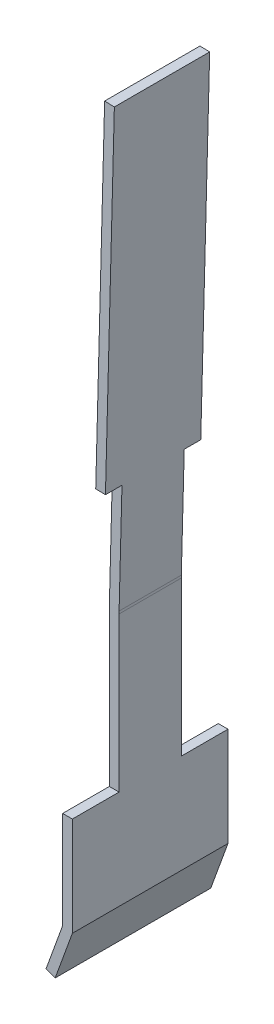
ISO-10303-21;
HEADER;
FILE_DESCRIPTION(('STEP AP214'),'2;1');
FILE_NAME('part.step','',(''),(''),'','','');
FILE_SCHEMA(('AUTOMOTIVE_DESIGN { 1 0 10303 214 1 1 1 1 }'));
ENDSEC;
DATA;
#1=APPLICATION_CONTEXT('core data for automotive mechanical design processes');
#2=APPLICATION_PROTOCOL_DEFINITION('international standard','automotive_design',2000,#1);
#3=PRODUCT_CONTEXT('',#1,'mechanical');
#4=PRODUCT('Part','Part','',(#3));
#5=PRODUCT_RELATED_PRODUCT_CATEGORY('part','',(#4));
#6=PRODUCT_DEFINITION_FORMATION('','',#4);
#7=PRODUCT_DEFINITION_CONTEXT('part definition',#1,'design');
#8=PRODUCT_DEFINITION('design','',#6,#7);
#9=PRODUCT_DEFINITION_SHAPE('','',#8);
#10=(LENGTH_UNIT() NAMED_UNIT(*) SI_UNIT(.MILLI.,.METRE.));
#11=(NAMED_UNIT(*) PLANE_ANGLE_UNIT() SI_UNIT($,.RADIAN.));
#12=(NAMED_UNIT(*) SI_UNIT($,.STERADIAN.) SOLID_ANGLE_UNIT());
#13=UNCERTAINTY_MEASURE_WITH_UNIT(LENGTH_MEASURE(1.E-05),#10,'distance_accuracy_value','');
#14=(GEOMETRIC_REPRESENTATION_CONTEXT(3) GLOBAL_UNCERTAINTY_ASSIGNED_CONTEXT((#13)) GLOBAL_UNIT_ASSIGNED_CONTEXT((#10,
#11,#12)) REPRESENTATION_CONTEXT('',''));
#15=CARTESIAN_POINT('',(0.,0.,0.));
#16=DIRECTION('',(0.,0.,1.));
#17=DIRECTION('',(1.,0.,0.));
#18=AXIS2_PLACEMENT_3D('',#15,#16,#17);
#19=CARTESIAN_POINT('',(11.,17.8560021120668,16.));
#20=DIRECTION('',(0.,0.,1.));
#21=DIRECTION('',(1.,0.,0.));
#22=AXIS2_PLACEMENT_3D('',#19,#20,#21);
#23=CYLINDRICAL_SURFACE('',#22,10.);
#24=DIRECTION('',(0.,0.,-1.));
#25=VECTOR('',#24,1.);
#26=CARTESIAN_POINT('',(1.00342675024443,18.1177715951455,16.));
#27=LINE('',#26,#25);
#28=CARTESIAN_POINT('',(1.00342675024443,18.1177715951456,11.2));
#29=VERTEX_POINT('',#28);
#30=CARTESIAN_POINT('',(1.00342675024443,18.1177715951456,4.8));
#31=VERTEX_POINT('',#30);
#32=EDGE_CURVE('E353',#29,#31,#27,.T.);
#33=ORIENTED_EDGE('',*,*,#32,.F.);
#34=CARTESIAN_POINT('',(11.,17.8560021120668,11.2));
#35=DIRECTION('',(0.,0.,-1.));
#36=DIRECTION('',(-1.,0.,0.));
#37=AXIS2_PLACEMENT_3D('',#34,#35,#36);
#38=CIRCLE('',#37,10.);
#39=CARTESIAN_POINT('',(1.,17.8560021120668,11.2));
#40=VERTEX_POINT('',#39);
#41=EDGE_CURVE('E49',#29,#40,#38,.F.);
#42=ORIENTED_EDGE('',*,*,#41,.T.);
#43=DIRECTION('',(0.,0.,-1.));
#44=VECTOR('',#43,1.);
#45=CARTESIAN_POINT('',(1.,17.8560021120668,16.));
#46=LINE('',#45,#44);
#47=CARTESIAN_POINT('',(1.,17.8560021120668,4.8));
#48=VERTEX_POINT('',#47);
#49=EDGE_CURVE('E357',#48,#40,#46,.F.);
#50=ORIENTED_EDGE('',*,*,#49,.F.);
#51=CARTESIAN_POINT('',(11.,17.8560021120668,4.8));
#52=DIRECTION('',(0.,0.,1.));
#53=DIRECTION('',(0.,-1.,0.));
#54=AXIS2_PLACEMENT_3D('',#51,#52,#53);
#55=CIRCLE('',#54,10.);
#56=EDGE_CURVE('E11',#48,#31,#55,.F.);
#57=ORIENTED_EDGE('',*,*,#56,.T.);
#58=EDGE_LOOP('',(#33,#42,#50,#57));
#59=FACE_BOUND('',#58,.T.);
#60=ADVANCED_FACE('F41',(#59),#23,.F.);
#61=CARTESIAN_POINT('',(10.,17.8690928291517,16.));
#62=DIRECTION('',(0.,0.,1.));
#63=DIRECTION('',(1.,0.,0.));
#64=AXIS2_PLACEMENT_3D('',#61,#62,#63);
#65=CYLINDRICAL_SURFACE('',#64,10.);
#66=DIRECTION('',(0.,0.,1.));
#67=VECTOR('',#66,1.);
#68=CARTESIAN_POINT('',(0.00342675024442819,18.1308623122304,16.));
#69=LINE('',#68,#67);
#70=CARTESIAN_POINT('',(0.00342675024442779,18.1308623122304,4.8));
#71=VERTEX_POINT('',#70);
#72=CARTESIAN_POINT('',(0.00342675024442784,18.1308623122304,11.2));
#73=VERTEX_POINT('',#72);
#74=EDGE_CURVE('E339',#71,#73,#69,.T.);
#75=ORIENTED_EDGE('',*,*,#74,.F.);
#76=CARTESIAN_POINT('',(10.,17.8690928291517,4.8));
#77=DIRECTION('',(0.,0.,1.));
#78=DIRECTION('',(0.,-1.,0.));
#79=AXIS2_PLACEMENT_3D('',#76,#77,#78);
#80=CIRCLE('',#79,10.);
#81=CARTESIAN_POINT('',(0.,17.8690928291516,4.8));
#82=VERTEX_POINT('',#81);
#83=EDGE_CURVE('E350',#82,#71,#80,.F.);
#84=ORIENTED_EDGE('',*,*,#83,.F.);
#85=DIRECTION('',(0.,0.,1.));
#86=VECTOR('',#85,1.);
#87=CARTESIAN_POINT('',(0.,17.8690928291517,16.));
#88=LINE('',#87,#86);
#89=CARTESIAN_POINT('',(0.,17.8690928291516,11.2));
#90=VERTEX_POINT('',#89);
#91=EDGE_CURVE('E346',#90,#82,#88,.F.);
#92=ORIENTED_EDGE('',*,*,#91,.F.);
#93=CARTESIAN_POINT('',(10.,17.8690928291517,11.2));
#94=DIRECTION('',(0.,0.,-1.));
#95=DIRECTION('',(0.,1.,0.));
#96=AXIS2_PLACEMENT_3D('',#93,#94,#95);
#97=CIRCLE('',#96,10.);
#98=EDGE_CURVE('E343',#73,#90,#97,.F.);
#99=ORIENTED_EDGE('',*,*,#98,.F.);
#100=EDGE_LOOP('',(#75,#84,#92,#99));
#101=FACE_BOUND('',#100,.T.);
#102=ADVANCED_FACE('F408',(#101),#65,.T.);
#103=CARTESIAN_POINT('',(0.,0.,16.));
#104=DIRECTION('',(0.,0.,-1.));
#105=DIRECTION('',(-1.,0.,0.));
#106=AXIS2_PLACEMENT_3D('',#103,#104,#105);
#107=PLANE('',#106);
#108=DIRECTION('',(0.,1.,0.));
#109=VECTOR('',#108,1.);
#110=CARTESIAN_POINT('',(1.,0.,16.));
#111=LINE('',#110,#109);
#112=CARTESIAN_POINT('',(0.999999999999999,-8.17632698070847,16.));
#113=VERTEX_POINT('',#112);
#114=CARTESIAN_POINT('',(1.,1.99850372470002,16.));
#115=VERTEX_POINT('',#114);
#116=EDGE_CURVE('E318',#113,#115,#111,.T.);
#117=ORIENTED_EDGE('',*,*,#116,.T.);
#118=DIRECTION('',(1.,0.,0.));
#119=VECTOR('',#118,1.);
#120=CARTESIAN_POINT('',(-9.,1.99850372470002,16.));
#121=LINE('',#120,#119);
#122=CARTESIAN_POINT('',(0.,1.99850372470002,16.));
#123=VERTEX_POINT('',#122);
#124=EDGE_CURVE('E230',#123,#115,#121,.T.);
#125=ORIENTED_EDGE('',*,*,#124,.F.);
#126=DIRECTION('',(0.,1.,0.));
#127=VECTOR('',#126,1.);
#128=CARTESIAN_POINT('',(0.,0.,16.));
#129=LINE('',#128,#127);
#130=CARTESIAN_POINT('',(0.,-8.,16.));
#131=VERTEX_POINT('',#130);
#132=EDGE_CURVE('E314',#131,#123,#129,.T.);
#133=ORIENTED_EDGE('',*,*,#132,.F.);
#134=DIRECTION('',(-0.342020143325671,-0.939692620785908,0.));
#135=VECTOR('',#134,1.);
#136=CARTESIAN_POINT('',(0.,-8.,16.));
#137=LINE('',#136,#135);
#138=CARTESIAN_POINT('',(-1.71010071662835,-12.6984631039295,16.));
#139=VERTEX_POINT('',#138);
#140=EDGE_CURVE('E171',#131,#139,#137,.T.);
#141=ORIENTED_EDGE('',*,*,#140,.T.);
#142=DIRECTION('',(0.939692620785908,-0.342020143325671,0.));
#143=VECTOR('',#142,1.);
#144=CARTESIAN_POINT('',(-1.71010071662835,-12.6984631039295,16.));
#145=LINE('',#144,#143);
#146=CARTESIAN_POINT('',(-0.770408095842446,-13.0404832472552,16.));
#147=VERTEX_POINT('',#146);
#148=EDGE_CURVE('E164',#139,#147,#145,.T.);
#149=ORIENTED_EDGE('',*,*,#148,.T.);
#150=DIRECTION('',(-0.342020143325671,-0.939692620785908,0.));
#151=VECTOR('',#150,1.);
#152=CARTESIAN_POINT('',(0.939692620785907,-8.34202014332567,16.));
#153=LINE('',#152,#151);
#154=EDGE_CURVE('E169',#113,#147,#153,.T.);
#155=ORIENTED_EDGE('',*,*,#154,.F.);
#156=EDGE_LOOP('',(#117,#125,#133,#141,#149,#155));
#157=FACE_BOUND('',#156,.T.);
#158=ADVANCED_FACE('F167',(#157),#107,.F.);
#159=CARTESIAN_POINT('',(0.999657324975557,17.9738230516921,16.));
#160=DIRECTION('',(-0.999657324975557,0.0261769483078733,0.));
#161=DIRECTION('',(-0.0261769483078733,-0.999657324975557,0.));
#162=AXIS2_PLACEMENT_3D('',#159,#160,#161);
#163=PLANE('',#162);
#164=DIRECTION('',(0.0261769483078733,0.999657324975557,0.));
#165=VECTOR('',#164,1.);
#166=CARTESIAN_POINT('',(2.21688542129167,64.4578886630555,11.2));
#167=LINE('',#166,#165);
#168=CARTESIAN_POINT('',(1.3006922305161,29.4698822889111,11.2));
#169=VERTEX_POINT('',#168);
#170=EDGE_CURVE('E308',#29,#169,#167,.T.);
#171=ORIENTED_EDGE('',*,*,#170,.F.);
#172=ORIENTED_EDGE('',*,*,#32,.T.);
#173=DIRECTION('',(-0.0261769483078733,-0.999657324975557,0.));
#174=VECTOR('',#173,1.);
#175=CARTESIAN_POINT('',(2.21688542129167,64.4578886630555,4.8));
#176=LINE('',#175,#174);
#177=CARTESIAN_POINT('',(1.3006922305161,29.4698822889111,4.8));
#178=VERTEX_POINT('',#177);
#179=EDGE_CURVE('E307',#178,#31,#176,.T.);
#180=ORIENTED_EDGE('',*,*,#179,.F.);
#181=DIRECTION('',(0.,0.,1.));
#182=VECTOR('',#181,1.);
#183=CARTESIAN_POINT('',(1.3006922305161,29.4698822889111,3.1));
#184=LINE('',#183,#182);
#185=CARTESIAN_POINT('',(1.3006922305161,29.4698822889111,3.1));
#186=VERTEX_POINT('',#185);
#187=EDGE_CURVE('E247',#186,#178,#184,.T.);
#188=ORIENTED_EDGE('',*,*,#187,.F.);
#189=DIRECTION('',(-0.0261769483078733,-0.999657324975557,0.));
#190=VECTOR('',#189,1.);
#191=CARTESIAN_POINT('',(2.21688542129167,64.4578886630555,3.1));
#192=LINE('',#191,#190);
#193=CARTESIAN_POINT('',(2.21688542129167,64.4578886630555,3.1));
#194=VERTEX_POINT('',#193);
#195=EDGE_CURVE('E243',#194,#186,#192,.T.);
#196=ORIENTED_EDGE('',*,*,#195,.F.);
#197=DIRECTION('',(0.,0.,-1.));
#198=VECTOR('',#197,1.);
#199=CARTESIAN_POINT('',(2.21688542129167,64.4578886630556,16.));
#200=LINE('',#199,#198);
#201=CARTESIAN_POINT('',(2.21688542129167,64.4578886630555,12.9));
#202=VERTEX_POINT('',#201);
#203=EDGE_CURVE('E331',#202,#194,#200,.T.);
#204=ORIENTED_EDGE('',*,*,#203,.F.);
#205=DIRECTION('',(0.0261769483078733,0.999657324975557,0.));
#206=VECTOR('',#205,1.);
#207=CARTESIAN_POINT('',(2.21688542129167,64.4578886630555,12.9));
#208=LINE('',#207,#206);
#209=CARTESIAN_POINT('',(1.3006922305161,29.4698822889111,12.9));
#210=VERTEX_POINT('',#209);
#211=EDGE_CURVE('E272',#210,#202,#208,.T.);
#212=ORIENTED_EDGE('',*,*,#211,.F.);
#213=DIRECTION('',(0.,0.,1.));
#214=VECTOR('',#213,1.);
#215=CARTESIAN_POINT('',(1.3006922305161,29.4698822889111,12.9));
#216=LINE('',#215,#214);
#217=EDGE_CURVE('E268',#169,#210,#216,.T.);
#218=ORIENTED_EDGE('',*,*,#217,.F.);
#219=EDGE_LOOP('',(#171,#172,#180,#188,#196,#204,#212,#218));
#220=FACE_BOUND('',#219,.T.);
#221=ADVANCED_FACE('F393',(#220),#163,.F.);
#222=CARTESIAN_POINT('',(1.21722809631611,64.4840656113634,16.));
#223=DIRECTION('',(0.0261769483078517,0.999657324975558,0.));
#224=DIRECTION('',(-0.999657324975558,0.0261769483078517,0.));
#225=AXIS2_PLACEMENT_3D('',#222,#223,#224);
#226=PLANE('',#225);
#227=DIRECTION('',(0.,0.,-1.));
#228=VECTOR('',#227,1.);
#229=CARTESIAN_POINT('',(1.21722809631611,64.4840656113634,16.));
#230=LINE('',#229,#228);
#231=CARTESIAN_POINT('',(1.21722809631611,64.4840656113634,12.9));
#232=VERTEX_POINT('',#231);
#233=CARTESIAN_POINT('',(1.21722809631611,64.4840656113634,3.1));
#234=VERTEX_POINT('',#233);
#235=EDGE_CURVE('E322',#232,#234,#230,.T.);
#236=ORIENTED_EDGE('',*,*,#235,.F.);
#237=DIRECTION('',(-0.999657324975557,0.0261769483078733,0.));
#238=VECTOR('',#237,1.);
#239=CARTESIAN_POINT('',(2.21688542129167,64.4578886630555,12.9));
#240=LINE('',#239,#238);
#241=EDGE_CURVE('E284',#202,#232,#240,.T.);
#242=ORIENTED_EDGE('',*,*,#241,.F.);
#243=ORIENTED_EDGE('',*,*,#203,.T.);
#244=DIRECTION('',(-0.999657324975557,0.0261769483078733,0.));
#245=VECTOR('',#244,1.);
#246=CARTESIAN_POINT('',(2.21688542129167,64.4578886630555,3.1));
#247=LINE('',#246,#245);
#248=EDGE_CURVE('E252',#194,#234,#247,.T.);
#249=ORIENTED_EDGE('',*,*,#248,.T.);
#250=EDGE_LOOP('',(#236,#242,#243,#249));
#251=FACE_BOUND('',#250,.T.);
#252=ADVANCED_FACE('F419',(#251),#226,.T.);
#253=CARTESIAN_POINT('',(0.,18.,16.));
#254=DIRECTION('',(-0.999657324975557,0.0261769483078733,0.));
#255=DIRECTION('',(-0.0261769483078733,-0.999657324975557,0.));
#256=AXIS2_PLACEMENT_3D('',#253,#254,#255);
#257=PLANE('',#256);
#258=DIRECTION('',(0.0261769483078733,0.999657324975557,0.));
#259=VECTOR('',#258,1.);
#260=CARTESIAN_POINT('',(0.,18.,4.8));
#261=LINE('',#260,#259);
#262=CARTESIAN_POINT('',(0.301034905540543,29.4960592372189,4.8));
#263=VERTEX_POINT('',#262);
#264=EDGE_CURVE('E61',#71,#263,#261,.T.);
#265=ORIENTED_EDGE('',*,*,#264,.F.);
#266=ORIENTED_EDGE('',*,*,#74,.T.);
#267=DIRECTION('',(-0.0261769483078733,-0.999657324975557,0.));
#268=VECTOR('',#267,1.);
#269=CARTESIAN_POINT('',(0.,18.,11.2));
#270=LINE('',#269,#268);
#271=CARTESIAN_POINT('',(0.301034905540543,29.4960592372189,11.2));
#272=VERTEX_POINT('',#271);
#273=EDGE_CURVE('E336',#272,#73,#270,.T.);
#274=ORIENTED_EDGE('',*,*,#273,.F.);
#275=DIRECTION('',(0.,0.,1.));
#276=VECTOR('',#275,1.);
#277=CARTESIAN_POINT('',(0.301034905540543,29.4960592372189,12.9));
#278=LINE('',#277,#276);
#279=CARTESIAN_POINT('',(0.301034905540543,29.4960592372189,12.9));
#280=VERTEX_POINT('',#279);
#281=EDGE_CURVE('E261',#272,#280,#278,.T.);
#282=ORIENTED_EDGE('',*,*,#281,.T.);
#283=DIRECTION('',(0.0261769483078733,0.999657324975557,0.));
#284=VECTOR('',#283,1.);
#285=CARTESIAN_POINT('',(1.21722809631611,64.4840656113634,12.9));
#286=LINE('',#285,#284);
#287=EDGE_CURVE('E273',#280,#232,#286,.T.);
#288=ORIENTED_EDGE('',*,*,#287,.T.);
#289=ORIENTED_EDGE('',*,*,#235,.T.);
#290=DIRECTION('',(-0.0261769483078733,-0.999657324975557,0.));
#291=VECTOR('',#290,1.);
#292=CARTESIAN_POINT('',(1.21722809631611,64.4840656113634,3.1));
#293=LINE('',#292,#291);
#294=CARTESIAN_POINT('',(0.301034905540543,29.4960592372189,3.1));
#295=VERTEX_POINT('',#294);
#296=EDGE_CURVE('E242',#234,#295,#293,.T.);
#297=ORIENTED_EDGE('',*,*,#296,.T.);
#298=DIRECTION('',(0.,0.,1.));
#299=VECTOR('',#298,1.);
#300=CARTESIAN_POINT('',(0.301034905540543,29.4960592372189,3.1));
#301=LINE('',#300,#299);
#302=EDGE_CURVE('E248',#295,#263,#301,.T.);
#303=ORIENTED_EDGE('',*,*,#302,.T.);
#304=EDGE_LOOP('',(#265,#266,#274,#282,#288,#289,#297,#303));
#305=FACE_BOUND('',#304,.T.);
#306=ADVANCED_FACE('F403',(#305),#257,.T.);
#307=CARTESIAN_POINT('',(0.,0.,16.));
#308=DIRECTION('',(-1.,0.,0.));
#309=DIRECTION('',(0.,0.,1.));
#310=AXIS2_PLACEMENT_3D('',#307,#308,#309);
#311=PLANE('',#310);
#312=DIRECTION('',(0.,1.,0.));
#313=VECTOR('',#312,1.);
#314=CARTESIAN_POINT('',(0.,0.,4.8));
#315=LINE('',#314,#313);
#316=CARTESIAN_POINT('',(0.,1.99850372470002,4.8));
#317=VERTEX_POINT('',#316);
#318=EDGE_CURVE('E304',#317,#82,#315,.T.);
#319=ORIENTED_EDGE('',*,*,#318,.F.);
#320=DIRECTION('',(0.,0.,1.));
#321=VECTOR('',#320,1.);
#322=CARTESIAN_POINT('',(0.,1.99850372470002,16.));
#323=LINE('',#322,#321);
#324=CARTESIAN_POINT('',(0.,1.99850372470002,0.));
#325=VERTEX_POINT('',#324);
#326=EDGE_CURVE('E223',#325,#317,#323,.T.);
#327=ORIENTED_EDGE('',*,*,#326,.F.);
#328=DIRECTION('',(0.,1.,0.));
#329=VECTOR('',#328,1.);
#330=CARTESIAN_POINT('',(0.,0.,0.));
#331=LINE('',#330,#329);
#332=CARTESIAN_POINT('',(0.,-8.,0.));
#333=VERTEX_POINT('',#332);
#334=EDGE_CURVE('E311',#333,#325,#331,.T.);
#335=ORIENTED_EDGE('',*,*,#334,.F.);
#336=DIRECTION('',(0.,0.,-1.));
#337=VECTOR('',#336,1.);
#338=CARTESIAN_POINT('',(0.,-8.,16.));
#339=LINE('',#338,#337);
#340=EDGE_CURVE('E208',#131,#333,#339,.T.);
#341=ORIENTED_EDGE('',*,*,#340,.F.);
#342=ORIENTED_EDGE('',*,*,#132,.T.);
#343=DIRECTION('',(0.,0.,1.));
#344=VECTOR('',#343,1.);
#345=CARTESIAN_POINT('',(0.,1.99850372470002,16.));
#346=LINE('',#345,#344);
#347=CARTESIAN_POINT('',(0.,1.99850372470002,11.2));
#348=VERTEX_POINT('',#347);
#349=EDGE_CURVE('E239',#348,#123,#346,.T.);
#350=ORIENTED_EDGE('',*,*,#349,.F.);
#351=DIRECTION('',(0.,-1.,0.));
#352=VECTOR('',#351,1.);
#353=CARTESIAN_POINT('',(0.,0.,11.2));
#354=LINE('',#353,#352);
#355=EDGE_CURVE('E298',#90,#348,#354,.T.);
#356=ORIENTED_EDGE('',*,*,#355,.F.);
#357=ORIENTED_EDGE('',*,*,#91,.T.);
#358=EDGE_LOOP('',(#319,#327,#335,#341,#342,#350,#356,#357));
#359=FACE_BOUND('',#358,.T.);
#360=ADVANCED_FACE('F380',(#359),#311,.T.);
#361=CARTESIAN_POINT('',(1.,0.,16.));
#362=DIRECTION('',(-1.,0.,0.));
#363=DIRECTION('',(0.,0.,1.));
#364=AXIS2_PLACEMENT_3D('',#361,#362,#363);
#365=PLANE('',#364);
#366=DIRECTION('',(0.,0.,-1.));
#367=VECTOR('',#366,1.);
#368=CARTESIAN_POINT('',(1.,1.99850372470002,4.8));
#369=LINE('',#368,#367);
#370=CARTESIAN_POINT('',(1.,1.99850372470002,4.8));
#371=VERTEX_POINT('',#370);
#372=CARTESIAN_POINT('',(1.,1.99850372470002,0.));
#373=VERTEX_POINT('',#372);
#374=EDGE_CURVE('E214',#371,#373,#369,.T.);
#375=ORIENTED_EDGE('',*,*,#374,.F.);
#376=DIRECTION('',(0.,-1.,0.));
#377=VECTOR('',#376,1.);
#378=CARTESIAN_POINT('',(1.,17.9869092829152,4.8));
#379=LINE('',#378,#377);
#380=EDGE_CURVE('E295',#48,#371,#379,.T.);
#381=ORIENTED_EDGE('',*,*,#380,.F.);
#382=ORIENTED_EDGE('',*,*,#49,.T.);
#383=DIRECTION('',(0.,1.,0.));
#384=VECTOR('',#383,1.);
#385=CARTESIAN_POINT('',(1.,17.9869092829152,11.2));
#386=LINE('',#385,#384);
#387=CARTESIAN_POINT('',(1.,1.99850372470002,11.2));
#388=VERTEX_POINT('',#387);
#389=EDGE_CURVE('E288',#388,#40,#386,.T.);
#390=ORIENTED_EDGE('',*,*,#389,.F.);
#391=DIRECTION('',(0.,0.,-1.));
#392=VECTOR('',#391,1.);
#393=CARTESIAN_POINT('',(1.,1.99850372470002,11.2));
#394=LINE('',#393,#392);
#395=EDGE_CURVE('E207',#115,#388,#394,.T.);
#396=ORIENTED_EDGE('',*,*,#395,.F.);
#397=ORIENTED_EDGE('',*,*,#116,.F.);
#398=DIRECTION('',(0.,0.,-1.));
#399=VECTOR('',#398,1.);
#400=CARTESIAN_POINT('',(0.999999999999999,-8.17632698070847,16.));
#401=LINE('',#400,#399);
#402=CARTESIAN_POINT('',(0.999999999999999,-8.17632698070847,0.));
#403=VERTEX_POINT('',#402);
#404=EDGE_CURVE('E191',#113,#403,#401,.T.);
#405=ORIENTED_EDGE('',*,*,#404,.T.);
#406=DIRECTION('',(0.,1.,0.));
#407=VECTOR('',#406,1.);
#408=CARTESIAN_POINT('',(1.,0.,0.));
#409=LINE('',#408,#407);
#410=EDGE_CURVE('E319',#403,#373,#409,.T.);
#411=ORIENTED_EDGE('',*,*,#410,.T.);
#412=EDGE_LOOP('',(#375,#381,#382,#390,#396,#397,#405,#411));
#413=FACE_BOUND('',#412,.T.);
#414=ADVANCED_FACE('F369',(#413),#365,.F.);
#415=CARTESIAN_POINT('',(0.,0.,0.));
#416=DIRECTION('',(0.,0.,-1.));
#417=DIRECTION('',(-1.,0.,0.));
#418=AXIS2_PLACEMENT_3D('',#415,#416,#417);
#419=PLANE('',#418);
#420=DIRECTION('',(1.,0.,0.));
#421=VECTOR('',#420,1.);
#422=CARTESIAN_POINT('',(-9.,1.99850372470002,0.));
#423=LINE('',#422,#421);
#424=EDGE_CURVE('E219',#325,#373,#423,.T.);
#425=ORIENTED_EDGE('',*,*,#424,.T.);
#426=ORIENTED_EDGE('',*,*,#410,.F.);
#427=DIRECTION('',(-0.342020143325671,-0.939692620785908,0.));
#428=VECTOR('',#427,1.);
#429=CARTESIAN_POINT('',(0.939692620785907,-8.34202014332567,0.));
#430=LINE('',#429,#428);
#431=CARTESIAN_POINT('',(-0.770408095842446,-13.0404832472552,0.));
#432=VERTEX_POINT('',#431);
#433=EDGE_CURVE('E200',#403,#432,#430,.T.);
#434=ORIENTED_EDGE('',*,*,#433,.T.);
#435=DIRECTION('',(0.939692620785908,-0.342020143325671,0.));
#436=VECTOR('',#435,1.);
#437=CARTESIAN_POINT('',(-1.71010071662835,-12.6984631039295,0.));
#438=LINE('',#437,#436);
#439=CARTESIAN_POINT('',(-1.71010071662835,-12.6984631039295,0.));
#440=VERTEX_POINT('',#439);
#441=EDGE_CURVE('E181',#440,#432,#438,.T.);
#442=ORIENTED_EDGE('',*,*,#441,.F.);
#443=DIRECTION('',(-0.342020143325671,-0.939692620785908,0.));
#444=VECTOR('',#443,1.);
#445=CARTESIAN_POINT('',(0.,-8.,0.));
#446=LINE('',#445,#444);
#447=EDGE_CURVE('E193',#333,#440,#446,.T.);
#448=ORIENTED_EDGE('',*,*,#447,.F.);
#449=ORIENTED_EDGE('',*,*,#334,.T.);
#450=EDGE_LOOP('',(#425,#426,#434,#442,#448,#449));
#451=FACE_BOUND('',#450,.T.);
#452=ADVANCED_FACE('F386',(#451),#419,.T.);
#453=CARTESIAN_POINT('',(0.000834084400878118,64.5159180095567,4.8));
#454=DIRECTION('',(0.,0.,1.));
#455=DIRECTION('',(0.,-1.,0.));
#456=AXIS2_PLACEMENT_3D('',#453,#454,#455);
#457=PLANE('',#456);
#458=ORIENTED_EDGE('',*,*,#318,.T.);
#459=ORIENTED_EDGE('',*,*,#83,.T.);
#460=ORIENTED_EDGE('',*,*,#264,.T.);
#461=DIRECTION('',(-0.999657324975557,0.0261769483078733,0.));
#462=VECTOR('',#461,1.);
#463=CARTESIAN_POINT('',(1.3006922305161,29.4698822889111,4.8));
#464=LINE('',#463,#462);
#465=EDGE_CURVE('E56',#178,#263,#464,.T.);
#466=ORIENTED_EDGE('',*,*,#465,.F.);
#467=ORIENTED_EDGE('',*,*,#179,.T.);
#468=ORIENTED_EDGE('',*,*,#56,.F.);
#469=ORIENTED_EDGE('',*,*,#380,.T.);
#470=DIRECTION('',(1.,0.,0.));
#471=VECTOR('',#470,1.);
#472=CARTESIAN_POINT('',(-9.,1.99850372470002,4.8));
#473=LINE('',#472,#471);
#474=EDGE_CURVE('E217',#317,#371,#473,.T.);
#475=ORIENTED_EDGE('',*,*,#474,.F.);
#476=EDGE_LOOP('',(#458,#459,#460,#466,#467,#468,#469,#475));
#477=FACE_BOUND('',#476,.T.);
#478=ADVANCED_FACE('F390',(#477),#457,.F.);
#479=CARTESIAN_POINT('',(0.000834084400878118,64.5159180095567,11.2));
#480=DIRECTION('',(0.,0.,-1.));
#481=DIRECTION('',(0.,1.,0.));
#482=AXIS2_PLACEMENT_3D('',#479,#480,#481);
#483=PLANE('',#482);
#484=ORIENTED_EDGE('',*,*,#98,.T.);
#485=ORIENTED_EDGE('',*,*,#355,.T.);
#486=DIRECTION('',(1.,0.,0.));
#487=VECTOR('',#486,1.);
#488=CARTESIAN_POINT('',(-9.,1.99850372470002,11.2));
#489=LINE('',#488,#487);
#490=EDGE_CURVE('E218',#348,#388,#489,.T.);
#491=ORIENTED_EDGE('',*,*,#490,.T.);
#492=ORIENTED_EDGE('',*,*,#389,.T.);
#493=ORIENTED_EDGE('',*,*,#41,.F.);
#494=ORIENTED_EDGE('',*,*,#170,.T.);
#495=DIRECTION('',(-0.999657324975557,0.0261769483078733,0.));
#496=VECTOR('',#495,1.);
#497=CARTESIAN_POINT('',(1.3006922305161,29.4698822889111,11.2));
#498=LINE('',#497,#496);
#499=EDGE_CURVE('E277',#169,#272,#498,.T.);
#500=ORIENTED_EDGE('',*,*,#499,.T.);
#501=ORIENTED_EDGE('',*,*,#273,.T.);
#502=EDGE_LOOP('',(#484,#485,#491,#492,#493,#494,#500,#501));
#503=FACE_BOUND('',#502,.T.);
#504=ADVANCED_FACE('F371',(#503),#483,.F.);
#505=CARTESIAN_POINT('',(2.21688542129167,64.4578886630555,12.9));
#506=DIRECTION('',(0.,0.,1.));
#507=DIRECTION('',(0.,-1.,0.));
#508=AXIS2_PLACEMENT_3D('',#505,#506,#507);
#509=PLANE('',#508);
#510=ORIENTED_EDGE('',*,*,#287,.F.);
#511=DIRECTION('',(-0.999657324975557,0.0261769483078733,0.));
#512=VECTOR('',#511,1.);
#513=CARTESIAN_POINT('',(1.3006922305161,29.4698822889111,12.9));
#514=LINE('',#513,#512);
#515=EDGE_CURVE('E289',#210,#280,#514,.T.);
#516=ORIENTED_EDGE('',*,*,#515,.F.);
#517=ORIENTED_EDGE('',*,*,#211,.T.);
#518=ORIENTED_EDGE('',*,*,#241,.T.);
#519=EDGE_LOOP('',(#510,#516,#517,#518));
#520=FACE_BOUND('',#519,.T.);
#521=ADVANCED_FACE('F421',(#520),#509,.T.);
#522=CARTESIAN_POINT('',(1.3006922305161,29.4698822889111,12.9));
#523=DIRECTION('',(-0.0261769483078733,-0.999657324975557,0.));
#524=DIRECTION('',(0.999657324975557,-0.0261769483078733,0.));
#525=AXIS2_PLACEMENT_3D('',#522,#523,#524);
#526=PLANE('',#525);
#527=ORIENTED_EDGE('',*,*,#281,.F.);
#528=ORIENTED_EDGE('',*,*,#499,.F.);
#529=ORIENTED_EDGE('',*,*,#217,.T.);
#530=ORIENTED_EDGE('',*,*,#515,.T.);
#531=EDGE_LOOP('',(#527,#528,#529,#530));
#532=FACE_BOUND('',#531,.T.);
#533=ADVANCED_FACE('F400',(#532),#526,.T.);
#534=CARTESIAN_POINT('',(1.3006922305161,29.4698822889111,3.1));
#535=DIRECTION('',(-0.0261769483078733,-0.999657324975557,0.));
#536=DIRECTION('',(0.999657324975557,-0.0261769483078733,0.));
#537=AXIS2_PLACEMENT_3D('',#534,#535,#536);
#538=PLANE('',#537);
#539=ORIENTED_EDGE('',*,*,#302,.F.);
#540=DIRECTION('',(-0.999657324975557,0.0261769483078733,0.));
#541=VECTOR('',#540,1.);
#542=CARTESIAN_POINT('',(1.3006922305161,29.4698822889111,3.1));
#543=LINE('',#542,#541);
#544=EDGE_CURVE('E262',#186,#295,#543,.T.);
#545=ORIENTED_EDGE('',*,*,#544,.F.);
#546=ORIENTED_EDGE('',*,*,#187,.T.);
#547=ORIENTED_EDGE('',*,*,#465,.T.);
#548=EDGE_LOOP('',(#539,#545,#546,#547));
#549=FACE_BOUND('',#548,.T.);
#550=ADVANCED_FACE('F412',(#549),#538,.T.);
#551=CARTESIAN_POINT('',(2.21688542129167,64.4578886630555,3.1));
#552=DIRECTION('',(0.,0.,-1.));
#553=DIRECTION('',(0.,1.,0.));
#554=AXIS2_PLACEMENT_3D('',#551,#552,#553);
#555=PLANE('',#554);
#556=ORIENTED_EDGE('',*,*,#296,.F.);
#557=ORIENTED_EDGE('',*,*,#248,.F.);
#558=ORIENTED_EDGE('',*,*,#195,.T.);
#559=ORIENTED_EDGE('',*,*,#544,.T.);
#560=EDGE_LOOP('',(#556,#557,#558,#559));
#561=FACE_BOUND('',#560,.T.);
#562=ADVANCED_FACE('F417',(#561),#555,.T.);
#563=CARTESIAN_POINT('',(-9.,1.99850372470002,4.8));
#564=DIRECTION('',(0.,-1.,0.));
#565=DIRECTION('',(0.,0.,-1.));
#566=AXIS2_PLACEMENT_3D('',#563,#564,#565);
#567=PLANE('',#566);
#568=ORIENTED_EDGE('',*,*,#326,.T.);
#569=ORIENTED_EDGE('',*,*,#474,.T.);
#570=ORIENTED_EDGE('',*,*,#374,.T.);
#571=ORIENTED_EDGE('',*,*,#424,.F.);
#572=EDGE_LOOP('',(#568,#569,#570,#571));
#573=FACE_BOUND('',#572,.T.);
#574=ADVANCED_FACE('F388',(#573),#567,.F.);
#575=CARTESIAN_POINT('',(-9.,1.99850372470002,11.2));
#576=DIRECTION('',(0.,-1.,0.));
#577=DIRECTION('',(0.,0.,-1.));
#578=AXIS2_PLACEMENT_3D('',#575,#576,#577);
#579=PLANE('',#578);
#580=ORIENTED_EDGE('',*,*,#349,.T.);
#581=ORIENTED_EDGE('',*,*,#124,.T.);
#582=ORIENTED_EDGE('',*,*,#395,.T.);
#583=ORIENTED_EDGE('',*,*,#490,.F.);
#584=EDGE_LOOP('',(#580,#581,#582,#583));
#585=FACE_BOUND('',#584,.T.);
#586=ADVANCED_FACE('F376',(#585),#579,.F.);
#587=CARTESIAN_POINT('',(0.939692620785907,-8.34202014332567,16.));
#588=DIRECTION('',(0.939692620785908,-0.342020143325671,0.));
#589=DIRECTION('',(0.342020143325671,0.939692620785908,0.));
#590=AXIS2_PLACEMENT_3D('',#587,#588,#589);
#591=PLANE('',#590);
#592=ORIENTED_EDGE('',*,*,#433,.F.);
#593=ORIENTED_EDGE('',*,*,#404,.F.);
#594=ORIENTED_EDGE('',*,*,#154,.T.);
#595=DIRECTION('',(0.,0.,-1.));
#596=VECTOR('',#595,1.);
#597=CARTESIAN_POINT('',(-0.770408095842446,-13.0404832472552,16.));
#598=LINE('',#597,#596);
#599=EDGE_CURVE('E178',#147,#432,#598,.T.);
#600=ORIENTED_EDGE('',*,*,#599,.T.);
#601=EDGE_LOOP('',(#592,#593,#594,#600));
#602=FACE_BOUND('',#601,.T.);
#603=ADVANCED_FACE('F189',(#602),#591,.T.);
#604=CARTESIAN_POINT('',(0.,-8.,16.));
#605=DIRECTION('',(0.939692620785908,-0.342020143325671,0.));
#606=DIRECTION('',(0.342020143325671,0.939692620785908,0.));
#607=AXIS2_PLACEMENT_3D('',#604,#605,#606);
#608=PLANE('',#607);
#609=ORIENTED_EDGE('',*,*,#447,.T.);
#610=DIRECTION('',(0.,0.,-1.));
#611=VECTOR('',#610,1.);
#612=CARTESIAN_POINT('',(-1.71010071662835,-12.6984631039295,16.));
#613=LINE('',#612,#611);
#614=EDGE_CURVE('E186',#139,#440,#613,.T.);
#615=ORIENTED_EDGE('',*,*,#614,.F.);
#616=ORIENTED_EDGE('',*,*,#140,.F.);
#617=ORIENTED_EDGE('',*,*,#340,.T.);
#618=EDGE_LOOP('',(#609,#615,#616,#617));
#619=FACE_BOUND('',#618,.T.);
#620=ADVANCED_FACE('F384',(#619),#608,.F.);
#621=CARTESIAN_POINT('',(-1.71010071662835,-12.6984631039295,16.));
#622=DIRECTION('',(0.342020143325671,0.939692620785908,0.));
#623=DIRECTION('',(-0.939692620785908,0.342020143325671,0.));
#624=AXIS2_PLACEMENT_3D('',#621,#622,#623);
#625=PLANE('',#624);
#626=ORIENTED_EDGE('',*,*,#441,.T.);
#627=ORIENTED_EDGE('',*,*,#599,.F.);
#628=ORIENTED_EDGE('',*,*,#148,.F.);
#629=ORIENTED_EDGE('',*,*,#614,.T.);
#630=EDGE_LOOP('',(#626,#627,#628,#629));
#631=FACE_BOUND('',#630,.T.);
#632=ADVANCED_FACE('F179',(#631),#625,.F.);
#633=CLOSED_SHELL('',(#60,#102,#158,#221,#252,#306,#360,#414,#452,#478,#504,#521,#533,#550,#562,
#574,#586,#603,#620,#632));
#634=MANIFOLD_SOLID_BREP('B2',#633);
#635=ADVANCED_BREP_SHAPE_REPRESENTATION('',(#18,#634),#14);
#636=SHAPE_DEFINITION_REPRESENTATION(#9,#635);
ENDSEC;
END-ISO-10303-21;
